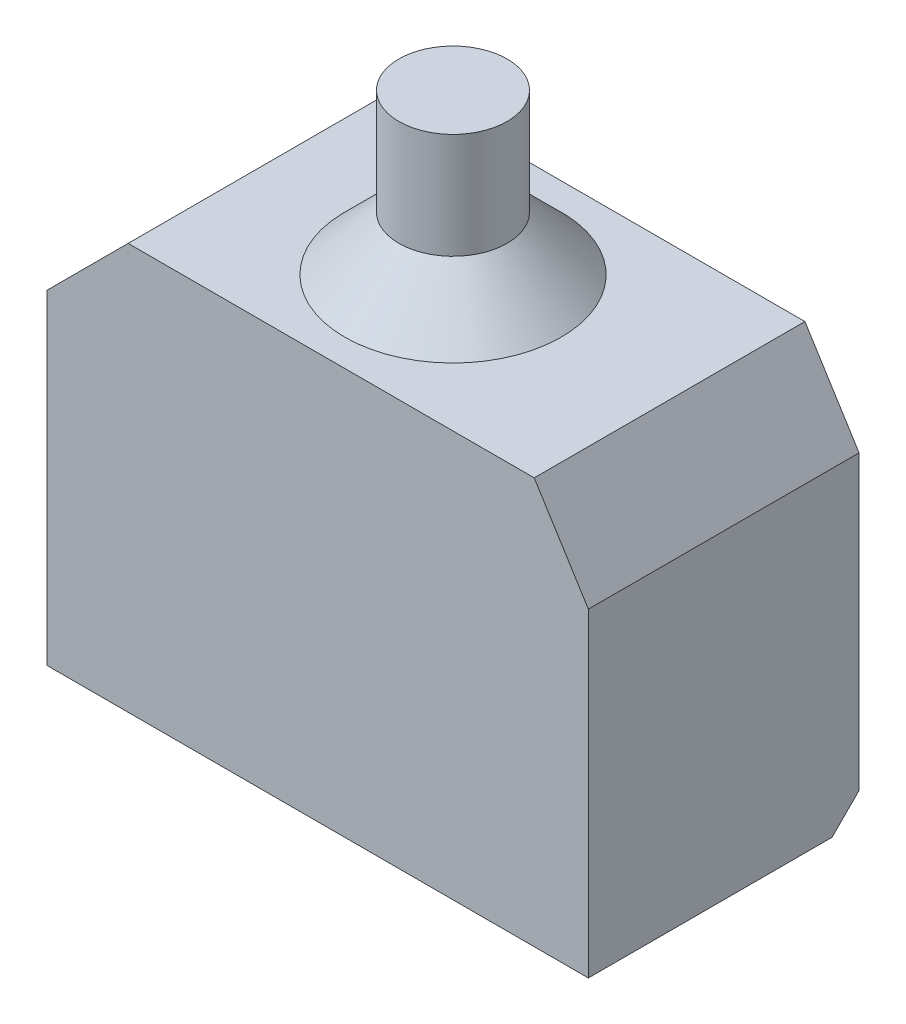
ISO-10303-21;
HEADER;
FILE_DESCRIPTION(('STEP AP214'),'2;1');
FILE_NAME('part.step','',(''),(''),'','','');
FILE_SCHEMA(('AUTOMOTIVE_DESIGN { 1 0 10303 214 1 1 1 1 }'));
ENDSEC;
DATA;
#1=APPLICATION_CONTEXT('core data for automotive mechanical design processes');
#2=APPLICATION_PROTOCOL_DEFINITION('international standard','automotive_design',2000,#1);
#3=PRODUCT_CONTEXT('',#1,'mechanical');
#4=PRODUCT('Part','Part','',(#3));
#5=PRODUCT_RELATED_PRODUCT_CATEGORY('part','',(#4));
#6=PRODUCT_DEFINITION_FORMATION('','',#4);
#7=PRODUCT_DEFINITION_CONTEXT('part definition',#1,'design');
#8=PRODUCT_DEFINITION('design','',#6,#7);
#9=PRODUCT_DEFINITION_SHAPE('','',#8);
#10=(LENGTH_UNIT() NAMED_UNIT(*) SI_UNIT(.MILLI.,.METRE.));
#11=(NAMED_UNIT(*) PLANE_ANGLE_UNIT() SI_UNIT($,.RADIAN.));
#12=(NAMED_UNIT(*) SI_UNIT($,.STERADIAN.) SOLID_ANGLE_UNIT());
#13=UNCERTAINTY_MEASURE_WITH_UNIT(LENGTH_MEASURE(1.E-05),#10,'distance_accuracy_value','');
#14=(GEOMETRIC_REPRESENTATION_CONTEXT(3) GLOBAL_UNCERTAINTY_ASSIGNED_CONTEXT((#13)) GLOBAL_UNIT_ASSIGNED_CONTEXT((#10,
#11,#12)) REPRESENTATION_CONTEXT('',''));
#15=CARTESIAN_POINT('',(0.,0.,0.));
#16=DIRECTION('',(0.,0.,1.));
#17=DIRECTION('',(1.,0.,0.));
#18=AXIS2_PLACEMENT_3D('',#15,#16,#17);
#19=CARTESIAN_POINT('',(-100.,150.,-50.));
#20=DIRECTION('',(1.,0.,0.));
#21=DIRECTION('',(0.,0.,-1.));
#22=AXIS2_PLACEMENT_3D('',#19,#20,#21);
#23=PLANE('',#22);
#24=DIRECTION('',(0.,-1.,0.));
#25=VECTOR('',#24,1.);
#26=CARTESIAN_POINT('',(-100.,150.,50.));
#27=LINE('',#26,#25);
#28=CARTESIAN_POINT('',(-100.,120.,50.));
#29=VERTEX_POINT('',#28);
#30=CARTESIAN_POINT('',(-100.,0.,50.));
#31=VERTEX_POINT('',#30);
#32=EDGE_CURVE('E134',#29,#31,#27,.T.);
#33=ORIENTED_EDGE('',*,*,#32,.F.);
#34=DIRECTION('',(0.,0.,-1.));
#35=VECTOR('',#34,1.);
#36=CARTESIAN_POINT('',(-100.,120.,-50.));
#37=LINE('',#36,#35);
#38=CARTESIAN_POINT('',(-100.,120.,-50.));
#39=VERTEX_POINT('',#38);
#40=EDGE_CURVE('E117',#29,#39,#37,.T.);
#41=ORIENTED_EDGE('',*,*,#40,.T.);
#42=DIRECTION('',(0.,-1.,0.));
#43=VECTOR('',#42,1.);
#44=CARTESIAN_POINT('',(-100.,150.,-50.));
#45=LINE('',#44,#43);
#46=CARTESIAN_POINT('',(-100.,0.,-50.));
#47=VERTEX_POINT('',#46);
#48=EDGE_CURVE('E139',#39,#47,#45,.T.);
#49=ORIENTED_EDGE('',*,*,#48,.T.);
#50=DIRECTION('',(0.,0.,1.));
#51=VECTOR('',#50,1.);
#52=CARTESIAN_POINT('',(-100.,0.,-50.));
#53=LINE('',#52,#51);
#54=EDGE_CURVE('E95',#47,#31,#53,.T.);
#55=ORIENTED_EDGE('',*,*,#54,.T.);
#56=EDGE_LOOP('',(#33,#41,#49,#55));
#57=FACE_BOUND('',#56,.T.);
#58=ADVANCED_FACE('F33',(#57),#23,.F.);
#59=CARTESIAN_POINT('',(-100.,150.,50.));
#60=DIRECTION('',(0.,0.,-1.));
#61=DIRECTION('',(-1.,0.,0.));
#62=AXIS2_PLACEMENT_3D('',#59,#60,#61);
#63=PLANE('',#62);
#64=DIRECTION('',(1.,0.,0.));
#65=VECTOR('',#64,1.);
#66=CARTESIAN_POINT('',(-100.,150.,50.));
#67=LINE('',#66,#65);
#68=CARTESIAN_POINT('',(-69.9999999999999,150.,50.));
#69=VERTEX_POINT('',#68);
#70=CARTESIAN_POINT('',(80.,150.,50.));
#71=VERTEX_POINT('',#70);
#72=EDGE_CURVE('E99',#69,#71,#67,.T.);
#73=ORIENTED_EDGE('',*,*,#72,.F.);
#74=DIRECTION('',(-0.707106781186548,-0.707106781186548,0.));
#75=VECTOR('',#74,1.);
#76=CARTESIAN_POINT('',(-69.9999999999999,150.,50.));
#77=LINE('',#76,#75);
#78=EDGE_CURVE('E119',#69,#29,#77,.T.);
#79=ORIENTED_EDGE('',*,*,#78,.T.);
#80=ORIENTED_EDGE('',*,*,#32,.T.);
#81=DIRECTION('',(1.,0.,0.));
#82=VECTOR('',#81,1.);
#83=CARTESIAN_POINT('',(-100.,0.,50.));
#84=LINE('',#83,#82);
#85=CARTESIAN_POINT('',(100.,0.,50.));
#86=VERTEX_POINT('',#85);
#87=EDGE_CURVE('E143',#31,#86,#84,.T.);
#88=ORIENTED_EDGE('',*,*,#87,.T.);
#89=DIRECTION('',(0.,-1.,0.));
#90=VECTOR('',#89,1.);
#91=CARTESIAN_POINT('',(100.,150.,50.));
#92=LINE('',#91,#90);
#93=CARTESIAN_POINT('',(100.,117.993309419179,50.));
#94=VERTEX_POINT('',#93);
#95=EDGE_CURVE('E136',#94,#86,#92,.T.);
#96=ORIENTED_EDGE('',*,*,#95,.F.);
#97=DIRECTION('',(-0.529919264233207,0.848048096156425,0.));
#98=VECTOR('',#97,1.);
#99=CARTESIAN_POINT('',(80.,150.,50.));
#100=LINE('',#99,#98);
#101=EDGE_CURVE('E124',#94,#71,#100,.T.);
#102=ORIENTED_EDGE('',*,*,#101,.T.);
#103=EDGE_LOOP('',(#73,#79,#80,#88,#96,#102));
#104=FACE_BOUND('',#103,.T.);
#105=ADVANCED_FACE('F170',(#104),#63,.F.);
#106=CARTESIAN_POINT('',(100.,150.,-50.));
#107=DIRECTION('',(-1.,0.,0.));
#108=DIRECTION('',(0.,0.,1.));
#109=AXIS2_PLACEMENT_3D('',#106,#107,#108);
#110=PLANE('',#109);
#111=DIRECTION('',(0.,-0.707106781186547,0.707106781186548));
#112=VECTOR('',#111,1.);
#113=CARTESIAN_POINT('',(100.,80.,-120.));
#114=LINE('',#113,#112);
#115=CARTESIAN_POINT('',(100.,10.,-50.));
#116=VERTEX_POINT('',#115);
#117=CARTESIAN_POINT('',(100.,0.,-40.));
#118=VERTEX_POINT('',#117);
#119=EDGE_CURVE('E53',#116,#118,#114,.T.);
#120=ORIENTED_EDGE('',*,*,#119,.F.);
#121=DIRECTION('',(0.,-1.,0.));
#122=VECTOR('',#121,1.);
#123=CARTESIAN_POINT('',(100.,150.,-50.));
#124=LINE('',#123,#122);
#125=CARTESIAN_POINT('',(100.,117.993309419179,-50.));
#126=VERTEX_POINT('',#125);
#127=EDGE_CURVE('E104',#126,#116,#124,.T.);
#128=ORIENTED_EDGE('',*,*,#127,.F.);
#129=DIRECTION('',(0.,0.,1.));
#130=VECTOR('',#129,1.);
#131=CARTESIAN_POINT('',(100.,117.993309419179,50.));
#132=LINE('',#131,#130);
#133=EDGE_CURVE('E127',#126,#94,#132,.T.);
#134=ORIENTED_EDGE('',*,*,#133,.T.);
#135=ORIENTED_EDGE('',*,*,#95,.T.);
#136=DIRECTION('',(0.,0.,-1.));
#137=VECTOR('',#136,1.);
#138=CARTESIAN_POINT('',(100.,0.,-50.));
#139=LINE('',#138,#137);
#140=EDGE_CURVE('E100',#86,#118,#139,.T.);
#141=ORIENTED_EDGE('',*,*,#140,.T.);
#142=EDGE_LOOP('',(#120,#128,#134,#135,#141));
#143=FACE_BOUND('',#142,.T.);
#144=ADVANCED_FACE('F176',(#143),#110,.F.);
#145=CARTESIAN_POINT('',(-100.,150.,-50.));
#146=DIRECTION('',(0.,0.,1.));
#147=DIRECTION('',(1.,0.,0.));
#148=AXIS2_PLACEMENT_3D('',#145,#146,#147);
#149=PLANE('',#148);
#150=DIRECTION('',(0.707106781186547,0.707106781186548,0.));
#151=VECTOR('',#150,1.);
#152=CARTESIAN_POINT('',(70.,-20.,-50.));
#153=LINE('',#152,#151);
#154=CARTESIAN_POINT('',(90.,0.,-50.));
#155=VERTEX_POINT('',#154);
#156=EDGE_CURVE('E41',#155,#116,#153,.T.);
#157=ORIENTED_EDGE('',*,*,#156,.F.);
#158=DIRECTION('',(-1.,0.,0.));
#159=VECTOR('',#158,1.);
#160=CARTESIAN_POINT('',(-100.,0.,-50.));
#161=LINE('',#160,#159);
#162=EDGE_CURVE('E90',#155,#47,#161,.T.);
#163=ORIENTED_EDGE('',*,*,#162,.T.);
#164=ORIENTED_EDGE('',*,*,#48,.F.);
#165=DIRECTION('',(0.707106781186548,0.707106781186548,0.));
#166=VECTOR('',#165,1.);
#167=CARTESIAN_POINT('',(-69.9999999999999,150.,-50.));
#168=LINE('',#167,#166);
#169=CARTESIAN_POINT('',(-69.9999999999999,150.,-50.));
#170=VERTEX_POINT('',#169);
#171=EDGE_CURVE('E115',#39,#170,#168,.T.);
#172=ORIENTED_EDGE('',*,*,#171,.T.);
#173=DIRECTION('',(-1.,0.,0.));
#174=VECTOR('',#173,1.);
#175=CARTESIAN_POINT('',(-100.,150.,-50.));
#176=LINE('',#175,#174);
#177=CARTESIAN_POINT('',(80.,150.,-50.));
#178=VERTEX_POINT('',#177);
#179=EDGE_CURVE('E140',#178,#170,#176,.T.);
#180=ORIENTED_EDGE('',*,*,#179,.F.);
#181=DIRECTION('',(0.529919264233207,-0.848048096156425,0.));
#182=VECTOR('',#181,1.);
#183=CARTESIAN_POINT('',(80.,150.,-50.));
#184=LINE('',#183,#182);
#185=EDGE_CURVE('E129',#178,#126,#184,.T.);
#186=ORIENTED_EDGE('',*,*,#185,.T.);
#187=ORIENTED_EDGE('',*,*,#127,.T.);
#188=EDGE_LOOP('',(#157,#163,#164,#172,#180,#186,#187));
#189=FACE_BOUND('',#188,.T.);
#190=ADVANCED_FACE('F103',(#189),#149,.F.);
#191=CARTESIAN_POINT('',(0.,150.,0.));
#192=DIRECTION('',(0.,1.,0.));
#193=DIRECTION('',(0.,0.,1.));
#194=AXIS2_PLACEMENT_3D('',#191,#192,#193);
#195=PLANE('',#194);
#196=CARTESIAN_POINT('',(0.,150.,0.));
#197=DIRECTION('',(0.,1.,0.));
#198=DIRECTION('',(0.,0.,1.));
#199=AXIS2_PLACEMENT_3D('',#196,#197,#198);
#200=CIRCLE('',#199,39.9999999999999);
#201=CARTESIAN_POINT('',(0.,150.,39.9999999999999));
#202=VERTEX_POINT('',#201);
#203=EDGE_CURVE('E107',#202,#202,#200,.F.);
#204=ORIENTED_EDGE('',*,*,#203,.T.);
#205=EDGE_LOOP('',(#204));
#206=FACE_BOUND('',#205,.T.);
#207=ORIENTED_EDGE('',*,*,#179,.T.);
#208=DIRECTION('',(0.,0.,1.));
#209=VECTOR('',#208,1.);
#210=CARTESIAN_POINT('',(-69.9999999999999,150.,50.));
#211=LINE('',#210,#209);
#212=EDGE_CURVE('E121',#170,#69,#211,.T.);
#213=ORIENTED_EDGE('',*,*,#212,.T.);
#214=ORIENTED_EDGE('',*,*,#72,.T.);
#215=DIRECTION('',(0.,0.,-1.));
#216=VECTOR('',#215,1.);
#217=CARTESIAN_POINT('',(80.,150.,-50.));
#218=LINE('',#217,#216);
#219=EDGE_CURVE('E131',#71,#178,#218,.T.);
#220=ORIENTED_EDGE('',*,*,#219,.T.);
#221=EDGE_LOOP('',(#207,#213,#214,#220));
#222=FACE_BOUND('',#221,.T.);
#223=ADVANCED_FACE('F166',(#206,#222),#195,.T.);
#224=CARTESIAN_POINT('',(0.,0.,0.));
#225=DIRECTION('',(0.,1.,0.));
#226=DIRECTION('',(0.,0.,1.));
#227=AXIS2_PLACEMENT_3D('',#224,#225,#226);
#228=PLANE('',#227);
#229=DIRECTION('',(-0.707106781186547,0.,-0.707106781186548));
#230=VECTOR('',#229,1.);
#231=CARTESIAN_POINT('',(70.,0.,-70.));
#232=LINE('',#231,#230);
#233=EDGE_CURVE('E11',#118,#155,#232,.T.);
#234=ORIENTED_EDGE('',*,*,#233,.F.);
#235=ORIENTED_EDGE('',*,*,#140,.F.);
#236=ORIENTED_EDGE('',*,*,#87,.F.);
#237=ORIENTED_EDGE('',*,*,#54,.F.);
#238=ORIENTED_EDGE('',*,*,#162,.F.);
#239=EDGE_LOOP('',(#234,#235,#236,#237,#238));
#240=FACE_BOUND('',#239,.T.);
#241=ADVANCED_FACE('F92',(#240),#228,.F.);
#242=CARTESIAN_POINT('',(0.,209.,0.));
#243=DIRECTION('',(0.,-1.,0.));
#244=DIRECTION('',(0.,0.,-1.));
#245=AXIS2_PLACEMENT_3D('',#242,#243,#244);
#246=CYLINDRICAL_SURFACE('',#245,20.);
#247=CARTESIAN_POINT('',(0.,170.,0.));
#248=DIRECTION('',(0.,1.,0.));
#249=DIRECTION('',(0.,0.,1.));
#250=AXIS2_PLACEMENT_3D('',#247,#248,#249);
#251=CIRCLE('',#250,20.);
#252=CARTESIAN_POINT('',(0.,170.,20.));
#253=VERTEX_POINT('',#252);
#254=EDGE_CURVE('E110',#253,#253,#251,.T.);
#255=ORIENTED_EDGE('',*,*,#254,.T.);
#256=EDGE_LOOP('',(#255));
#257=FACE_BOUND('',#256,.T.);
#258=CARTESIAN_POINT('',(0.,209.,0.));
#259=DIRECTION('',(0.,1.,0.));
#260=DIRECTION('',(0.,0.,1.));
#261=AXIS2_PLACEMENT_3D('',#258,#259,#260);
#262=CIRCLE('',#261,20.);
#263=CARTESIAN_POINT('',(0.,209.,20.));
#264=VERTEX_POINT('',#263);
#265=EDGE_CURVE('E147',#264,#264,#262,.T.);
#266=ORIENTED_EDGE('',*,*,#265,.F.);
#267=EDGE_LOOP('',(#266));
#268=FACE_BOUND('',#267,.T.);
#269=ADVANCED_FACE('F156',(#257,#268),#246,.T.);
#270=CARTESIAN_POINT('',(0.,209.,0.));
#271=DIRECTION('',(0.,1.,0.));
#272=DIRECTION('',(0.,0.,1.));
#273=AXIS2_PLACEMENT_3D('',#270,#271,#272);
#274=PLANE('',#273);
#275=ORIENTED_EDGE('',*,*,#265,.T.);
#276=EDGE_LOOP('',(#275));
#277=FACE_BOUND('',#276,.T.);
#278=ADVANCED_FACE('F154',(#277),#274,.T.);
#279=CARTESIAN_POINT('',(80.,150.,0.));
#280=DIRECTION('',(0.848048096156425,0.529919264233207,0.));
#281=DIRECTION('',(0.,0.,1.));
#282=AXIS2_PLACEMENT_3D('',#279,#280,#281);
#283=PLANE('',#282);
#284=ORIENTED_EDGE('',*,*,#101,.F.);
#285=ORIENTED_EDGE('',*,*,#133,.F.);
#286=ORIENTED_EDGE('',*,*,#185,.F.);
#287=ORIENTED_EDGE('',*,*,#219,.F.);
#288=EDGE_LOOP('',(#284,#285,#286,#287));
#289=FACE_BOUND('',#288,.T.);
#290=ADVANCED_FACE('F164',(#289),#283,.T.);
#291=CARTESIAN_POINT('',(-69.9999999999999,150.,0.));
#292=DIRECTION('',(-0.707106781186548,0.707106781186548,0.));
#293=DIRECTION('',(0.,0.,-1.));
#294=AXIS2_PLACEMENT_3D('',#291,#292,#293);
#295=PLANE('',#294);
#296=ORIENTED_EDGE('',*,*,#171,.F.);
#297=ORIENTED_EDGE('',*,*,#40,.F.);
#298=ORIENTED_EDGE('',*,*,#78,.F.);
#299=ORIENTED_EDGE('',*,*,#212,.F.);
#300=EDGE_LOOP('',(#296,#297,#298,#299));
#301=FACE_BOUND('',#300,.T.);
#302=ADVANCED_FACE('F183',(#301),#295,.T.);
#303=CARTESIAN_POINT('',(0.,170.,0.));
#304=DIRECTION('',(0.,-1.,0.));
#305=DIRECTION('',(0.,0.,-1.));
#306=AXIS2_PLACEMENT_3D('',#303,#304,#305);
#307=CONICAL_SURFACE('',#306,20.,0.785398163397441);
#308=ORIENTED_EDGE('',*,*,#203,.F.);
#309=EDGE_LOOP('',(#308));
#310=FACE_BOUND('',#309,.T.);
#311=ORIENTED_EDGE('',*,*,#254,.F.);
#312=EDGE_LOOP('',(#311));
#313=FACE_BOUND('',#312,.T.);
#314=ADVANCED_FACE('F35',(#310,#313),#307,.T.);
#315=CARTESIAN_POINT('',(46.6666666666667,-46.6666666666667,-46.6666666666667));
#316=DIRECTION('',(0.577350269189626,-0.577350269189626,-0.577350269189626));
#317=DIRECTION('',(0.707106781186547,0.707106781186548,0.));
#318=AXIS2_PLACEMENT_3D('',#315,#316,#317);
#319=PLANE('',#318);
#320=ORIENTED_EDGE('',*,*,#156,.T.);
#321=ORIENTED_EDGE('',*,*,#119,.T.);
#322=ORIENTED_EDGE('',*,*,#233,.T.);
#323=EDGE_LOOP('',(#320,#321,#322));
#324=FACE_BOUND('',#323,.T.);
#325=ADVANCED_FACE('F106',(#324),#319,.T.);
#326=CLOSED_SHELL('',(#58,#105,#144,#190,#223,#241,#269,#278,#290,#302,#314,#325));
#327=MANIFOLD_SOLID_BREP('B2',#326);
#328=ADVANCED_BREP_SHAPE_REPRESENTATION('',(#18,#327),#14);
#329=SHAPE_DEFINITION_REPRESENTATION(#9,#328);
ENDSEC;
END-ISO-10303-21;
